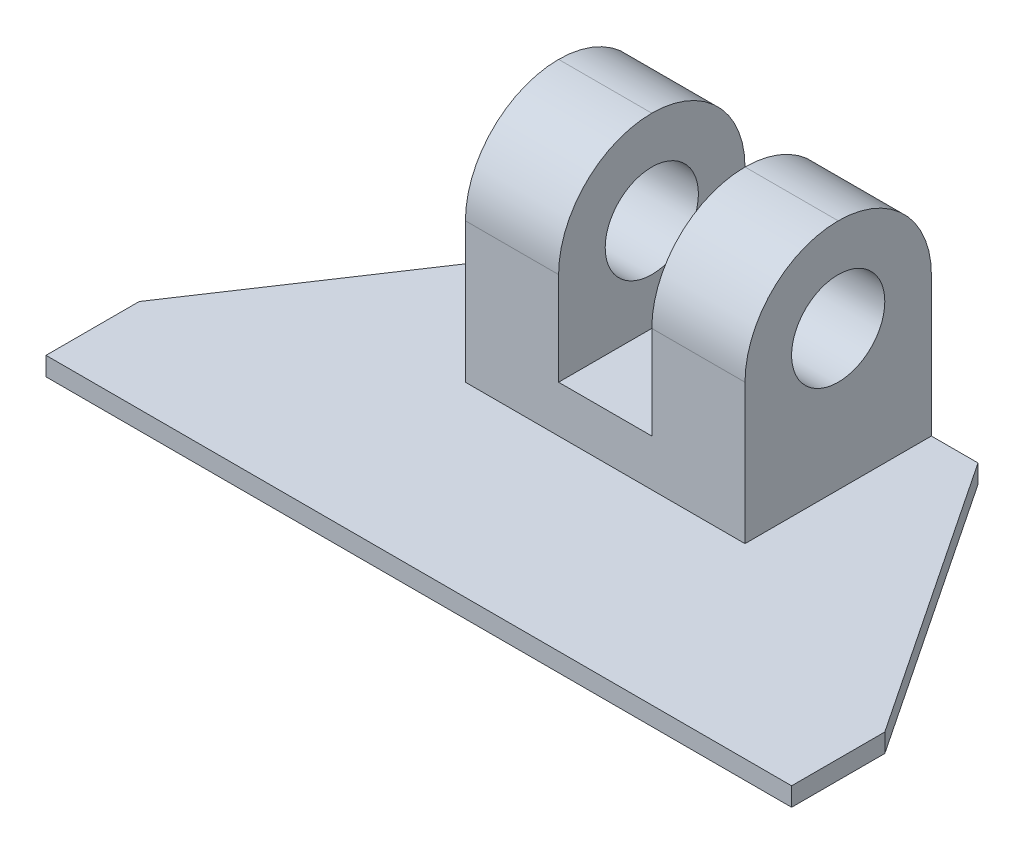
ISO-10303-21;
HEADER;
FILE_DESCRIPTION(('STEP AP214'),'2;1');
FILE_NAME('part.step','',(''),(''),'','','');
FILE_SCHEMA(('AUTOMOTIVE_DESIGN { 1 0 10303 214 1 1 1 1 }'));
ENDSEC;
DATA;
#1=APPLICATION_CONTEXT('core data for automotive mechanical design processes');
#2=APPLICATION_PROTOCOL_DEFINITION('international standard','automotive_design',2000,#1);
#3=PRODUCT_CONTEXT('',#1,'mechanical');
#4=PRODUCT('Part','Part','',(#3));
#5=PRODUCT_RELATED_PRODUCT_CATEGORY('part','',(#4));
#6=PRODUCT_DEFINITION_FORMATION('','',#4);
#7=PRODUCT_DEFINITION_CONTEXT('part definition',#1,'design');
#8=PRODUCT_DEFINITION('design','',#6,#7);
#9=PRODUCT_DEFINITION_SHAPE('','',#8);
#10=(LENGTH_UNIT() NAMED_UNIT(*) SI_UNIT(.MILLI.,.METRE.));
#11=(NAMED_UNIT(*) PLANE_ANGLE_UNIT() SI_UNIT($,.RADIAN.));
#12=(NAMED_UNIT(*) SI_UNIT($,.STERADIAN.) SOLID_ANGLE_UNIT());
#13=UNCERTAINTY_MEASURE_WITH_UNIT(LENGTH_MEASURE(1.E-05),#10,'distance_accuracy_value','');
#14=(GEOMETRIC_REPRESENTATION_CONTEXT(3) GLOBAL_UNCERTAINTY_ASSIGNED_CONTEXT((#13)) GLOBAL_UNIT_ASSIGNED_CONTEXT((#10,
#11,#12)) REPRESENTATION_CONTEXT('',''));
#15=CARTESIAN_POINT('',(0.,0.,0.));
#16=DIRECTION('',(0.,0.,1.));
#17=DIRECTION('',(1.,0.,0.));
#18=AXIS2_PLACEMENT_3D('',#15,#16,#17);
#19=CARTESIAN_POINT('',(-80.,17.,-30.));
#20=DIRECTION('',(1.,0.,0.));
#21=DIRECTION('',(0.,0.,-1.));
#22=AXIS2_PLACEMENT_3D('',#19,#20,#21);
#23=CYLINDRICAL_SURFACE('',#22,5.);
#24=CARTESIAN_POINT('',(-45.,17.,-30.));
#25=DIRECTION('',(-1.,0.,0.));
#26=DIRECTION('',(0.,0.,1.));
#27=AXIS2_PLACEMENT_3D('',#24,#25,#26);
#28=CIRCLE('',#27,5.);
#29=CARTESIAN_POINT('',(-45.,17.,-25.));
#30=VERTEX_POINT('',#29);
#31=EDGE_CURVE('E212',#30,#30,#28,.F.);
#32=ORIENTED_EDGE('',*,*,#31,.T.);
#33=EDGE_LOOP('',(#32));
#34=FACE_BOUND('',#33,.T.);
#35=CARTESIAN_POINT('',(-55.,17.,-30.));
#36=DIRECTION('',(1.,0.,0.));
#37=DIRECTION('',(0.,0.,-1.));
#38=AXIS2_PLACEMENT_3D('',#35,#36,#37);
#39=CIRCLE('',#38,5.);
#40=CARTESIAN_POINT('',(-55.,17.,-35.));
#41=VERTEX_POINT('',#40);
#42=EDGE_CURVE('E211',#41,#41,#39,.T.);
#43=ORIENTED_EDGE('',*,*,#42,.F.);
#44=EDGE_LOOP('',(#43));
#45=FACE_BOUND('',#44,.T.);
#46=ADVANCED_FACE('F45',(#34,#45),#23,.F.);
#47=CARTESIAN_POINT('',(0.,2.,0.));
#48=DIRECTION('',(-1.,0.,0.));
#49=DIRECTION('',(0.,0.,1.));
#50=AXIS2_PLACEMENT_3D('',#47,#48,#49);
#51=PLANE('',#50);
#52=DIRECTION('',(0.,0.,-1.));
#53=VECTOR('',#52,1.);
#54=CARTESIAN_POINT('',(0.,0.,0.));
#55=LINE('',#54,#53);
#56=CARTESIAN_POINT('',(0.,0.,0.));
#57=VERTEX_POINT('',#56);
#58=CARTESIAN_POINT('',(0.,0.,-10.));
#59=VERTEX_POINT('',#58);
#60=EDGE_CURVE('E251',#57,#59,#55,.T.);
#61=ORIENTED_EDGE('',*,*,#60,.T.);
#62=DIRECTION('',(0.,1.,0.));
#63=VECTOR('',#62,1.);
#64=CARTESIAN_POINT('',(0.,-3.,-10.));
#65=LINE('',#64,#63);
#66=CARTESIAN_POINT('',(0.,2.,-10.));
#67=VERTEX_POINT('',#66);
#68=EDGE_CURVE('E240',#59,#67,#65,.T.);
#69=ORIENTED_EDGE('',*,*,#68,.T.);
#70=DIRECTION('',(0.,0.,-1.));
#71=VECTOR('',#70,1.);
#72=CARTESIAN_POINT('',(0.,2.,0.));
#73=LINE('',#72,#71);
#74=CARTESIAN_POINT('',(0.,2.,0.));
#75=VERTEX_POINT('',#74);
#76=EDGE_CURVE('E262',#75,#67,#73,.T.);
#77=ORIENTED_EDGE('',*,*,#76,.F.);
#78=DIRECTION('',(0.,-1.,0.));
#79=VECTOR('',#78,1.);
#80=CARTESIAN_POINT('',(0.,2.,0.));
#81=LINE('',#80,#79);
#82=EDGE_CURVE('E278',#75,#57,#81,.T.);
#83=ORIENTED_EDGE('',*,*,#82,.T.);
#84=EDGE_LOOP('',(#61,#69,#77,#83));
#85=FACE_BOUND('',#84,.T.);
#86=ADVANCED_FACE('F391',(#85),#51,.F.);
#87=CARTESIAN_POINT('',(0.,2.,-40.));
#88=DIRECTION('',(0.,0.,1.));
#89=DIRECTION('',(1.,0.,0.));
#90=AXIS2_PLACEMENT_3D('',#87,#88,#89);
#91=PLANE('',#90);
#92=DIRECTION('',(0.,-1.,0.));
#93=VECTOR('',#92,1.);
#94=CARTESIAN_POINT('',(-55.,27.,-40.));
#95=LINE('',#94,#93);
#96=CARTESIAN_POINT('',(-55.,17.,-40.));
#97=VERTEX_POINT('',#96);
#98=CARTESIAN_POINT('',(-55.,2.,-40.));
#99=VERTEX_POINT('',#98);
#100=EDGE_CURVE('E228',#97,#99,#95,.T.);
#101=ORIENTED_EDGE('',*,*,#100,.F.);
#102=DIRECTION('',(-1.,0.,0.));
#103=VECTOR('',#102,1.);
#104=CARTESIAN_POINT('',(-45.,17.,-40.));
#105=LINE('',#104,#103);
#106=CARTESIAN_POINT('',(-45.,17.,-40.));
#107=VERTEX_POINT('',#106);
#108=EDGE_CURVE('E11',#97,#107,#105,.F.);
#109=ORIENTED_EDGE('',*,*,#108,.T.);
#110=DIRECTION('',(0.,1.,0.));
#111=VECTOR('',#110,1.);
#112=CARTESIAN_POINT('',(-45.,7.,-40.));
#113=LINE('',#112,#111);
#114=CARTESIAN_POINT('',(-45.,7.,-40.));
#115=VERTEX_POINT('',#114);
#116=EDGE_CURVE('E197',#115,#107,#113,.T.);
#117=ORIENTED_EDGE('',*,*,#116,.F.);
#118=DIRECTION('',(-1.,0.,0.));
#119=VECTOR('',#118,1.);
#120=CARTESIAN_POINT('',(-45.,7.,-40.));
#121=LINE('',#120,#119);
#122=CARTESIAN_POINT('',(-35.,7.,-40.));
#123=VERTEX_POINT('',#122);
#124=EDGE_CURVE('E172',#123,#115,#121,.T.);
#125=ORIENTED_EDGE('',*,*,#124,.F.);
#126=DIRECTION('',(0.,1.,0.));
#127=VECTOR('',#126,1.);
#128=CARTESIAN_POINT('',(-35.,7.,-40.));
#129=LINE('',#128,#127);
#130=CARTESIAN_POINT('',(-35.,17.,-40.));
#131=VERTEX_POINT('',#130);
#132=EDGE_CURVE('E201',#123,#131,#129,.T.);
#133=ORIENTED_EDGE('',*,*,#132,.T.);
#134=DIRECTION('',(-1.,0.,0.));
#135=VECTOR('',#134,1.);
#136=CARTESIAN_POINT('',(-25.,17.,-40.));
#137=LINE('',#136,#135);
#138=CARTESIAN_POINT('',(-25.,17.,-40.));
#139=VERTEX_POINT('',#138);
#140=EDGE_CURVE('E55',#131,#139,#137,.F.);
#141=ORIENTED_EDGE('',*,*,#140,.T.);
#142=DIRECTION('',(0.,-1.,0.));
#143=VECTOR('',#142,1.);
#144=CARTESIAN_POINT('',(-25.,27.,-40.));
#145=LINE('',#144,#143);
#146=CARTESIAN_POINT('',(-25.,2.,-40.));
#147=VERTEX_POINT('',#146);
#148=EDGE_CURVE('E231',#139,#147,#145,.T.);
#149=ORIENTED_EDGE('',*,*,#148,.T.);
#150=DIRECTION('',(-1.,0.,0.));
#151=VECTOR('',#150,1.);
#152=CARTESIAN_POINT('',(0.,2.,-40.));
#153=LINE('',#152,#151);
#154=CARTESIAN_POINT('',(-20.,2.,-40.));
#155=VERTEX_POINT('',#154);
#156=EDGE_CURVE('E268',#155,#147,#153,.T.);
#157=ORIENTED_EDGE('',*,*,#156,.F.);
#158=DIRECTION('',(0.,1.,0.));
#159=VECTOR('',#158,1.);
#160=CARTESIAN_POINT('',(-20.,-3.,-40.));
#161=LINE('',#160,#159);
#162=CARTESIAN_POINT('',(-20.,0.,-40.));
#163=VERTEX_POINT('',#162);
#164=EDGE_CURVE('E254',#163,#155,#161,.T.);
#165=ORIENTED_EDGE('',*,*,#164,.F.);
#166=DIRECTION('',(-1.,0.,0.));
#167=VECTOR('',#166,1.);
#168=CARTESIAN_POINT('',(0.,0.,-40.));
#169=LINE('',#168,#167);
#170=CARTESIAN_POINT('',(-60.,0.,-40.));
#171=VERTEX_POINT('',#170);
#172=EDGE_CURVE('E282',#163,#171,#169,.T.);
#173=ORIENTED_EDGE('',*,*,#172,.T.);
#174=DIRECTION('',(0.,1.,0.));
#175=VECTOR('',#174,1.);
#176=CARTESIAN_POINT('',(-60.,-3.,-40.));
#177=LINE('',#176,#175);
#178=CARTESIAN_POINT('',(-60.,2.,-40.));
#179=VERTEX_POINT('',#178);
#180=EDGE_CURVE('E247',#171,#179,#177,.T.);
#181=ORIENTED_EDGE('',*,*,#180,.T.);
#182=EDGE_CURVE('E266',#99,#179,#153,.T.);
#183=ORIENTED_EDGE('',*,*,#182,.F.);
#184=EDGE_LOOP('',(#101,#109,#117,#125,#133,#141,#149,#157,#165,#173,#181,#183));
#185=FACE_BOUND('',#184,.T.);
#186=ADVANCED_FACE('F354',(#185),#91,.F.);
#187=CARTESIAN_POINT('',(-80.,2.,0.));
#188=DIRECTION('',(1.,0.,0.));
#189=DIRECTION('',(0.,0.,-1.));
#190=AXIS2_PLACEMENT_3D('',#187,#188,#189);
#191=PLANE('',#190);
#192=DIRECTION('',(0.,0.,1.));
#193=VECTOR('',#192,1.);
#194=CARTESIAN_POINT('',(-80.,2.,0.));
#195=LINE('',#194,#193);
#196=CARTESIAN_POINT('',(-80.,2.,-9.99999999999999));
#197=VERTEX_POINT('',#196);
#198=CARTESIAN_POINT('',(-80.,2.,0.));
#199=VERTEX_POINT('',#198);
#200=EDGE_CURVE('E272',#197,#199,#195,.T.);
#201=ORIENTED_EDGE('',*,*,#200,.F.);
#202=DIRECTION('',(0.,1.,0.));
#203=VECTOR('',#202,1.);
#204=CARTESIAN_POINT('',(-80.,-3.,-9.99999999999999));
#205=LINE('',#204,#203);
#206=CARTESIAN_POINT('',(-80.,0.,-9.99999999999999));
#207=VERTEX_POINT('',#206);
#208=EDGE_CURVE('E245',#207,#197,#205,.T.);
#209=ORIENTED_EDGE('',*,*,#208,.F.);
#210=DIRECTION('',(0.,0.,1.));
#211=VECTOR('',#210,1.);
#212=CARTESIAN_POINT('',(-80.,0.,0.));
#213=LINE('',#212,#211);
#214=CARTESIAN_POINT('',(-80.,0.,0.));
#215=VERTEX_POINT('',#214);
#216=EDGE_CURVE('E286',#207,#215,#213,.T.);
#217=ORIENTED_EDGE('',*,*,#216,.T.);
#218=DIRECTION('',(0.,-1.,0.));
#219=VECTOR('',#218,1.);
#220=CARTESIAN_POINT('',(-80.,2.,0.));
#221=LINE('',#220,#219);
#222=EDGE_CURVE('E294',#199,#215,#221,.T.);
#223=ORIENTED_EDGE('',*,*,#222,.F.);
#224=EDGE_LOOP('',(#201,#209,#217,#223));
#225=FACE_BOUND('',#224,.T.);
#226=ADVANCED_FACE('F485',(#225),#191,.F.);
#227=CARTESIAN_POINT('',(0.,2.,0.));
#228=DIRECTION('',(0.,0.,-1.));
#229=DIRECTION('',(-1.,0.,0.));
#230=AXIS2_PLACEMENT_3D('',#227,#228,#229);
#231=PLANE('',#230);
#232=DIRECTION('',(1.,0.,0.));
#233=VECTOR('',#232,1.);
#234=CARTESIAN_POINT('',(0.,0.,0.));
#235=LINE('',#234,#233);
#236=EDGE_CURVE('E267',#215,#57,#235,.T.);
#237=ORIENTED_EDGE('',*,*,#236,.T.);
#238=ORIENTED_EDGE('',*,*,#82,.F.);
#239=DIRECTION('',(1.,0.,0.));
#240=VECTOR('',#239,1.);
#241=CARTESIAN_POINT('',(0.,2.,0.));
#242=LINE('',#241,#240);
#243=EDGE_CURVE('E275',#199,#75,#242,.T.);
#244=ORIENTED_EDGE('',*,*,#243,.F.);
#245=ORIENTED_EDGE('',*,*,#222,.T.);
#246=EDGE_LOOP('',(#237,#238,#244,#245));
#247=FACE_BOUND('',#246,.T.);
#248=ADVANCED_FACE('F526',(#247),#231,.F.);
#249=CARTESIAN_POINT('',(0.,2.,0.));
#250=DIRECTION('',(0.,1.,0.));
#251=DIRECTION('',(0.,0.,1.));
#252=AXIS2_PLACEMENT_3D('',#249,#250,#251);
#253=PLANE('',#252);
#254=DIRECTION('',(0.,0.,1.));
#255=VECTOR('',#254,1.);
#256=CARTESIAN_POINT('',(-55.,2.,-40.));
#257=LINE('',#256,#255);
#258=CARTESIAN_POINT('',(-55.,2.,-20.));
#259=VERTEX_POINT('',#258);
#260=EDGE_CURVE('E216',#99,#259,#257,.T.);
#261=ORIENTED_EDGE('',*,*,#260,.F.);
#262=ORIENTED_EDGE('',*,*,#182,.T.);
#263=DIRECTION('',(0.554700196225229,0.,-0.832050294337844));
#264=VECTOR('',#263,1.);
#265=CARTESIAN_POINT('',(-80.,2.,-9.99999999999999));
#266=LINE('',#265,#264);
#267=EDGE_CURVE('E241',#197,#179,#266,.T.);
#268=ORIENTED_EDGE('',*,*,#267,.F.);
#269=ORIENTED_EDGE('',*,*,#200,.T.);
#270=ORIENTED_EDGE('',*,*,#243,.T.);
#271=ORIENTED_EDGE('',*,*,#76,.T.);
#272=DIRECTION('',(0.554700196225229,0.,0.832050294337844));
#273=VECTOR('',#272,1.);
#274=CARTESIAN_POINT('',(0.,2.,-10.));
#275=LINE('',#274,#273);
#276=EDGE_CURVE('E246',#155,#67,#275,.T.);
#277=ORIENTED_EDGE('',*,*,#276,.F.);
#278=ORIENTED_EDGE('',*,*,#156,.T.);
#279=DIRECTION('',(0.,0.,-1.));
#280=VECTOR('',#279,1.);
#281=CARTESIAN_POINT('',(-25.,2.,-40.));
#282=LINE('',#281,#280);
#283=CARTESIAN_POINT('',(-25.,2.,-20.));
#284=VERTEX_POINT('',#283);
#285=EDGE_CURVE('E224',#284,#147,#282,.T.);
#286=ORIENTED_EDGE('',*,*,#285,.F.);
#287=DIRECTION('',(1.,0.,0.));
#288=VECTOR('',#287,1.);
#289=CARTESIAN_POINT('',(-55.,2.,-20.));
#290=LINE('',#289,#288);
#291=EDGE_CURVE('E220',#259,#284,#290,.T.);
#292=ORIENTED_EDGE('',*,*,#291,.F.);
#293=EDGE_LOOP('',(#261,#262,#268,#269,#270,#271,#277,#278,#286,#292));
#294=FACE_BOUND('',#293,.T.);
#295=ADVANCED_FACE('F360',(#294),#253,.T.);
#296=CARTESIAN_POINT('',(0.,0.,0.));
#297=DIRECTION('',(0.,1.,0.));
#298=DIRECTION('',(0.,0.,1.));
#299=AXIS2_PLACEMENT_3D('',#296,#297,#298);
#300=PLANE('',#299);
#301=ORIENTED_EDGE('',*,*,#216,.F.);
#302=DIRECTION('',(0.554700196225229,0.,-0.832050294337844));
#303=VECTOR('',#302,1.);
#304=CARTESIAN_POINT('',(-60.,0.,-40.));
#305=LINE('',#304,#303);
#306=EDGE_CURVE('E302',#207,#171,#305,.T.);
#307=ORIENTED_EDGE('',*,*,#306,.T.);
#308=ORIENTED_EDGE('',*,*,#172,.F.);
#309=DIRECTION('',(0.554700196225229,0.,0.832050294337844));
#310=VECTOR('',#309,1.);
#311=CARTESIAN_POINT('',(4.61538461538462,0.,-3.07692307692308));
#312=LINE('',#311,#310);
#313=EDGE_CURVE('E298',#163,#59,#312,.T.);
#314=ORIENTED_EDGE('',*,*,#313,.T.);
#315=ORIENTED_EDGE('',*,*,#60,.F.);
#316=ORIENTED_EDGE('',*,*,#236,.F.);
#317=EDGE_LOOP('',(#301,#307,#308,#314,#315,#316));
#318=FACE_BOUND('',#317,.T.);
#319=ADVANCED_FACE('F507',(#318),#300,.F.);
#320=CARTESIAN_POINT('',(0.,-3.,-10.));
#321=DIRECTION('',(-0.832050294337844,0.,0.554700196225229));
#322=DIRECTION('',(0.554700196225229,0.,0.832050294337844));
#323=AXIS2_PLACEMENT_3D('',#320,#321,#322);
#324=PLANE('',#323);
#325=ORIENTED_EDGE('',*,*,#164,.T.);
#326=ORIENTED_EDGE('',*,*,#276,.T.);
#327=ORIENTED_EDGE('',*,*,#68,.F.);
#328=ORIENTED_EDGE('',*,*,#313,.F.);
#329=EDGE_LOOP('',(#325,#326,#327,#328));
#330=FACE_BOUND('',#329,.T.);
#331=ADVANCED_FACE('F497',(#330),#324,.F.);
#332=CARTESIAN_POINT('',(-80.,-3.,-9.99999999999999));
#333=DIRECTION('',(0.832050294337844,0.,0.554700196225229));
#334=DIRECTION('',(0.554700196225229,0.,-0.832050294337844));
#335=AXIS2_PLACEMENT_3D('',#332,#333,#334);
#336=PLANE('',#335);
#337=ORIENTED_EDGE('',*,*,#208,.T.);
#338=ORIENTED_EDGE('',*,*,#267,.T.);
#339=ORIENTED_EDGE('',*,*,#180,.F.);
#340=ORIENTED_EDGE('',*,*,#306,.F.);
#341=EDGE_LOOP('',(#337,#338,#339,#340));
#342=FACE_BOUND('',#341,.T.);
#343=ADVANCED_FACE('F475',(#342),#336,.F.);
#344=CARTESIAN_POINT('',(-55.,27.,-40.));
#345=DIRECTION('',(1.,0.,0.));
#346=DIRECTION('',(0.,0.,-1.));
#347=AXIS2_PLACEMENT_3D('',#344,#345,#346);
#348=PLANE('',#347);
#349=ORIENTED_EDGE('',*,*,#42,.T.);
#350=EDGE_LOOP('',(#349));
#351=FACE_BOUND('',#350,.T.);
#352=DIRECTION('',(0.,-1.,0.));
#353=VECTOR('',#352,1.);
#354=CARTESIAN_POINT('',(-55.,27.,-20.));
#355=LINE('',#354,#353);
#356=CARTESIAN_POINT('',(-55.,17.,-20.));
#357=VERTEX_POINT('',#356);
#358=EDGE_CURVE('E237',#357,#259,#355,.T.);
#359=ORIENTED_EDGE('',*,*,#358,.F.);
#360=CARTESIAN_POINT('',(-55.,17.,-30.));
#361=DIRECTION('',(1.,0.,0.));
#362=DIRECTION('',(0.,0.,-1.));
#363=AXIS2_PLACEMENT_3D('',#360,#361,#362);
#364=CIRCLE('',#363,10.);
#365=CARTESIAN_POINT('',(-55.,27.,-30.));
#366=VERTEX_POINT('',#365);
#367=EDGE_CURVE('E68',#357,#366,#364,.F.);
#368=ORIENTED_EDGE('',*,*,#367,.T.);
#369=CARTESIAN_POINT('',(-55.,17.,-30.));
#370=DIRECTION('',(1.,0.,0.));
#371=DIRECTION('',(0.,0.,-1.));
#372=AXIS2_PLACEMENT_3D('',#369,#370,#371);
#373=CIRCLE('',#372,10.);
#374=EDGE_CURVE('E63',#366,#97,#373,.F.);
#375=ORIENTED_EDGE('',*,*,#374,.T.);
#376=ORIENTED_EDGE('',*,*,#100,.T.);
#377=ORIENTED_EDGE('',*,*,#260,.T.);
#378=EDGE_LOOP('',(#359,#368,#375,#376,#377));
#379=FACE_BOUND('',#378,.T.);
#380=ADVANCED_FACE('F357',(#351,#379),#348,.F.);
#381=CARTESIAN_POINT('',(-55.,27.,-20.));
#382=DIRECTION('',(0.,0.,-1.));
#383=DIRECTION('',(-1.,0.,0.));
#384=AXIS2_PLACEMENT_3D('',#381,#382,#383);
#385=PLANE('',#384);
#386=DIRECTION('',(0.,-1.,0.));
#387=VECTOR('',#386,1.);
#388=CARTESIAN_POINT('',(-25.,27.,-20.));
#389=LINE('',#388,#387);
#390=CARTESIAN_POINT('',(-25.,17.,-20.));
#391=VERTEX_POINT('',#390);
#392=EDGE_CURVE('E234',#391,#284,#389,.T.);
#393=ORIENTED_EDGE('',*,*,#392,.F.);
#394=DIRECTION('',(1.,0.,0.));
#395=VECTOR('',#394,1.);
#396=CARTESIAN_POINT('',(-35.,17.,-20.));
#397=LINE('',#396,#395);
#398=CARTESIAN_POINT('',(-35.,17.,-20.));
#399=VERTEX_POINT('',#398);
#400=EDGE_CURVE('E321',#391,#399,#397,.F.);
#401=ORIENTED_EDGE('',*,*,#400,.T.);
#402=DIRECTION('',(0.,1.,0.));
#403=VECTOR('',#402,1.);
#404=CARTESIAN_POINT('',(-35.,7.,-20.));
#405=LINE('',#404,#403);
#406=CARTESIAN_POINT('',(-35.,7.,-20.));
#407=VERTEX_POINT('',#406);
#408=EDGE_CURVE('E171',#407,#399,#405,.T.);
#409=ORIENTED_EDGE('',*,*,#408,.F.);
#410=DIRECTION('',(1.,0.,0.));
#411=VECTOR('',#410,1.);
#412=CARTESIAN_POINT('',(-45.,7.,-20.));
#413=LINE('',#412,#411);
#414=CARTESIAN_POINT('',(-45.,7.,-20.));
#415=VERTEX_POINT('',#414);
#416=EDGE_CURVE('E178',#415,#407,#413,.T.);
#417=ORIENTED_EDGE('',*,*,#416,.F.);
#418=DIRECTION('',(0.,1.,0.));
#419=VECTOR('',#418,1.);
#420=CARTESIAN_POINT('',(-45.,7.,-20.));
#421=LINE('',#420,#419);
#422=CARTESIAN_POINT('',(-45.,17.,-20.));
#423=VERTEX_POINT('',#422);
#424=EDGE_CURVE('E157',#415,#423,#421,.T.);
#425=ORIENTED_EDGE('',*,*,#424,.T.);
#426=DIRECTION('',(1.,0.,0.));
#427=VECTOR('',#426,1.);
#428=CARTESIAN_POINT('',(-55.,17.,-20.));
#429=LINE('',#428,#427);
#430=EDGE_CURVE('E318',#423,#357,#429,.F.);
#431=ORIENTED_EDGE('',*,*,#430,.T.);
#432=ORIENTED_EDGE('',*,*,#358,.T.);
#433=ORIENTED_EDGE('',*,*,#291,.T.);
#434=EDGE_LOOP('',(#393,#401,#409,#417,#425,#431,#432,#433));
#435=FACE_BOUND('',#434,.T.);
#436=ADVANCED_FACE('F186',(#435),#385,.F.);
#437=CARTESIAN_POINT('',(-25.,27.,-40.));
#438=DIRECTION('',(-1.,0.,0.));
#439=DIRECTION('',(0.,0.,1.));
#440=AXIS2_PLACEMENT_3D('',#437,#438,#439);
#441=PLANE('',#440);
#442=CARTESIAN_POINT('',(-25.,17.,-30.));
#443=DIRECTION('',(1.,0.,0.));
#444=DIRECTION('',(0.,0.,-1.));
#445=AXIS2_PLACEMENT_3D('',#442,#443,#444);
#446=CIRCLE('',#445,5.);
#447=CARTESIAN_POINT('',(-25.,17.,-35.));
#448=VERTEX_POINT('',#447);
#449=EDGE_CURVE('E207',#448,#448,#446,.T.);
#450=ORIENTED_EDGE('',*,*,#449,.F.);
#451=EDGE_LOOP('',(#450));
#452=FACE_BOUND('',#451,.T.);
#453=CARTESIAN_POINT('',(-25.,17.,-30.));
#454=DIRECTION('',(-1.,0.,0.));
#455=DIRECTION('',(0.,0.,1.));
#456=AXIS2_PLACEMENT_3D('',#453,#454,#455);
#457=CIRCLE('',#456,10.);
#458=CARTESIAN_POINT('',(-25.,27.,-30.));
#459=VERTEX_POINT('',#458);
#460=EDGE_CURVE('E306',#139,#459,#457,.F.);
#461=ORIENTED_EDGE('',*,*,#460,.T.);
#462=CARTESIAN_POINT('',(-25.,17.,-30.));
#463=DIRECTION('',(-1.,0.,0.));
#464=DIRECTION('',(0.,0.,1.));
#465=AXIS2_PLACEMENT_3D('',#462,#463,#464);
#466=CIRCLE('',#465,10.);
#467=EDGE_CURVE('E315',#459,#391,#466,.F.);
#468=ORIENTED_EDGE('',*,*,#467,.T.);
#469=ORIENTED_EDGE('',*,*,#392,.T.);
#470=ORIENTED_EDGE('',*,*,#285,.T.);
#471=ORIENTED_EDGE('',*,*,#148,.F.);
#472=EDGE_LOOP('',(#461,#468,#469,#470,#471));
#473=FACE_BOUND('',#472,.T.);
#474=ADVANCED_FACE('F376',(#452,#473),#441,.F.);
#475=CARTESIAN_POINT('',(-35.,17.,-30.));
#476=DIRECTION('',(1.,0.,0.));
#477=DIRECTION('',(0.,0.,-1.));
#478=AXIS2_PLACEMENT_3D('',#475,#476,#477);
#479=CIRCLE('',#478,5.);
#480=CARTESIAN_POINT('',(-35.,17.,-35.));
#481=VERTEX_POINT('',#480);
#482=EDGE_CURVE('E200',#481,#481,#479,.F.);
#483=ORIENTED_EDGE('',*,*,#482,.T.);
#484=EDGE_LOOP('',(#483));
#485=FACE_BOUND('',#484,.T.);
#486=ORIENTED_EDGE('',*,*,#449,.T.);
#487=EDGE_LOOP('',(#486));
#488=FACE_BOUND('',#487,.T.);
#489=ADVANCED_FACE('F378',(#485,#488),#23,.F.);
#490=CARTESIAN_POINT('',(-45.,7.,-20.));
#491=DIRECTION('',(-1.,0.,0.));
#492=DIRECTION('',(0.,0.,1.));
#493=AXIS2_PLACEMENT_3D('',#490,#491,#492);
#494=PLANE('',#493);
#495=CARTESIAN_POINT('',(-45.,17.,-30.));
#496=DIRECTION('',(-1.,0.,0.));
#497=DIRECTION('',(0.,0.,1.));
#498=AXIS2_PLACEMENT_3D('',#495,#496,#497);
#499=CIRCLE('',#498,10.);
#500=CARTESIAN_POINT('',(-45.,27.,-30.));
#501=VERTEX_POINT('',#500);
#502=EDGE_CURVE('E330',#107,#501,#499,.F.);
#503=ORIENTED_EDGE('',*,*,#502,.T.);
#504=CARTESIAN_POINT('',(-45.,17.,-30.));
#505=DIRECTION('',(-1.,0.,0.));
#506=DIRECTION('',(0.,0.,1.));
#507=AXIS2_PLACEMENT_3D('',#504,#505,#506);
#508=CIRCLE('',#507,10.);
#509=EDGE_CURVE('E165',#501,#423,#508,.F.);
#510=ORIENTED_EDGE('',*,*,#509,.T.);
#511=ORIENTED_EDGE('',*,*,#424,.F.);
#512=DIRECTION('',(0.,0.,1.));
#513=VECTOR('',#512,1.);
#514=CARTESIAN_POINT('',(-45.,7.,-20.));
#515=LINE('',#514,#513);
#516=EDGE_CURVE('E162',#115,#415,#515,.T.);
#517=ORIENTED_EDGE('',*,*,#516,.F.);
#518=ORIENTED_EDGE('',*,*,#116,.T.);
#519=EDGE_LOOP('',(#503,#510,#511,#517,#518));
#520=FACE_BOUND('',#519,.T.);
#521=ORIENTED_EDGE('',*,*,#31,.F.);
#522=EDGE_LOOP('',(#521));
#523=FACE_BOUND('',#522,.T.);
#524=ADVANCED_FACE('F159',(#520,#523),#494,.F.);
#525=CARTESIAN_POINT('',(-35.,7.,-20.));
#526=DIRECTION('',(1.,0.,0.));
#527=DIRECTION('',(0.,0.,-1.));
#528=AXIS2_PLACEMENT_3D('',#525,#526,#527);
#529=PLANE('',#528);
#530=ORIENTED_EDGE('',*,*,#408,.T.);
#531=CARTESIAN_POINT('',(-35.,17.,-30.));
#532=DIRECTION('',(1.,0.,0.));
#533=DIRECTION('',(0.,0.,-1.));
#534=AXIS2_PLACEMENT_3D('',#531,#532,#533);
#535=CIRCLE('',#534,10.);
#536=CARTESIAN_POINT('',(-35.,27.,-30.));
#537=VERTEX_POINT('',#536);
#538=EDGE_CURVE('E327',#399,#537,#535,.F.);
#539=ORIENTED_EDGE('',*,*,#538,.T.);
#540=CARTESIAN_POINT('',(-35.,17.,-30.));
#541=DIRECTION('',(1.,0.,0.));
#542=DIRECTION('',(0.,0.,-1.));
#543=AXIS2_PLACEMENT_3D('',#540,#541,#542);
#544=CIRCLE('',#543,10.);
#545=EDGE_CURVE('E324',#537,#131,#544,.F.);
#546=ORIENTED_EDGE('',*,*,#545,.T.);
#547=ORIENTED_EDGE('',*,*,#132,.F.);
#548=DIRECTION('',(0.,0.,-1.));
#549=VECTOR('',#548,1.);
#550=CARTESIAN_POINT('',(-35.,7.,-20.));
#551=LINE('',#550,#549);
#552=EDGE_CURVE('E190',#407,#123,#551,.T.);
#553=ORIENTED_EDGE('',*,*,#552,.F.);
#554=EDGE_LOOP('',(#530,#539,#546,#547,#553));
#555=FACE_BOUND('',#554,.T.);
#556=ORIENTED_EDGE('',*,*,#482,.F.);
#557=EDGE_LOOP('',(#556));
#558=FACE_BOUND('',#557,.T.);
#559=ADVANCED_FACE('F368',(#555,#558),#529,.F.);
#560=CARTESIAN_POINT('',(0.,7.,0.));
#561=DIRECTION('',(0.,-1.,0.));
#562=DIRECTION('',(0.,0.,-1.));
#563=AXIS2_PLACEMENT_3D('',#560,#561,#562);
#564=PLANE('',#563);
#565=ORIENTED_EDGE('',*,*,#516,.T.);
#566=ORIENTED_EDGE('',*,*,#416,.T.);
#567=ORIENTED_EDGE('',*,*,#552,.T.);
#568=ORIENTED_EDGE('',*,*,#124,.T.);
#569=EDGE_LOOP('',(#565,#566,#567,#568));
#570=FACE_BOUND('',#569,.T.);
#571=ADVANCED_FACE('F176',(#570),#564,.F.);
#572=CARTESIAN_POINT('',(0.,17.,-30.));
#573=DIRECTION('',(1.,0.,0.));
#574=DIRECTION('',(0.,0.,-1.));
#575=AXIS2_PLACEMENT_3D('',#572,#573,#574);
#576=CYLINDRICAL_SURFACE('',#575,10.);
#577=ORIENTED_EDGE('',*,*,#140,.F.);
#578=ORIENTED_EDGE('',*,*,#545,.F.);
#579=DIRECTION('',(-1.,0.,0.));
#580=VECTOR('',#579,1.);
#581=CARTESIAN_POINT('',(-35.,27.,-30.));
#582=LINE('',#581,#580);
#583=EDGE_CURVE('E183',#459,#537,#582,.T.);
#584=ORIENTED_EDGE('',*,*,#583,.F.);
#585=ORIENTED_EDGE('',*,*,#460,.F.);
#586=EDGE_LOOP('',(#577,#578,#584,#585));
#587=FACE_BOUND('',#586,.T.);
#588=ADVANCED_FACE('F372',(#587),#576,.T.);
#589=CARTESIAN_POINT('',(0.,17.,-30.));
#590=DIRECTION('',(-1.,0.,0.));
#591=DIRECTION('',(0.,0.,1.));
#592=AXIS2_PLACEMENT_3D('',#589,#590,#591);
#593=CYLINDRICAL_SURFACE('',#592,10.);
#594=ORIENTED_EDGE('',*,*,#538,.F.);
#595=ORIENTED_EDGE('',*,*,#400,.F.);
#596=ORIENTED_EDGE('',*,*,#467,.F.);
#597=ORIENTED_EDGE('',*,*,#583,.T.);
#598=EDGE_LOOP('',(#594,#595,#596,#597));
#599=FACE_BOUND('',#598,.T.);
#600=ADVANCED_FACE('F365',(#599),#593,.T.);
#601=CARTESIAN_POINT('',(0.,17.,-30.));
#602=DIRECTION('',(1.,0.,0.));
#603=DIRECTION('',(0.,0.,-1.));
#604=AXIS2_PLACEMENT_3D('',#601,#602,#603);
#605=CYLINDRICAL_SURFACE('',#604,10.);
#606=ORIENTED_EDGE('',*,*,#108,.F.);
#607=ORIENTED_EDGE('',*,*,#374,.F.);
#608=DIRECTION('',(-1.,0.,0.));
#609=VECTOR('',#608,1.);
#610=CARTESIAN_POINT('',(-55.,27.,-30.));
#611=LINE('',#610,#609);
#612=EDGE_CURVE('E49',#501,#366,#611,.T.);
#613=ORIENTED_EDGE('',*,*,#612,.F.);
#614=ORIENTED_EDGE('',*,*,#502,.F.);
#615=EDGE_LOOP('',(#606,#607,#613,#614));
#616=FACE_BOUND('',#615,.T.);
#617=ADVANCED_FACE('F47',(#616),#605,.T.);
#618=CARTESIAN_POINT('',(0.,17.,-30.));
#619=DIRECTION('',(-1.,0.,0.));
#620=DIRECTION('',(0.,0.,1.));
#621=AXIS2_PLACEMENT_3D('',#618,#619,#620);
#622=CYLINDRICAL_SURFACE('',#621,10.);
#623=ORIENTED_EDGE('',*,*,#367,.F.);
#624=ORIENTED_EDGE('',*,*,#430,.F.);
#625=ORIENTED_EDGE('',*,*,#509,.F.);
#626=ORIENTED_EDGE('',*,*,#612,.T.);
#627=EDGE_LOOP('',(#623,#624,#625,#626));
#628=FACE_BOUND('',#627,.T.);
#629=ADVANCED_FACE('F349',(#628),#622,.T.);
#630=CLOSED_SHELL('',(#46,#86,#186,#226,#248,#295,#319,#331,#343,#380,#436,#474,#489,#524,#559,
#571,#588,#600,#617,#629));
#631=MANIFOLD_SOLID_BREP('B2',#630);
#632=ADVANCED_BREP_SHAPE_REPRESENTATION('',(#18,#631),#14);
#633=SHAPE_DEFINITION_REPRESENTATION(#9,#632);
ENDSEC;
END-ISO-10303-21;
